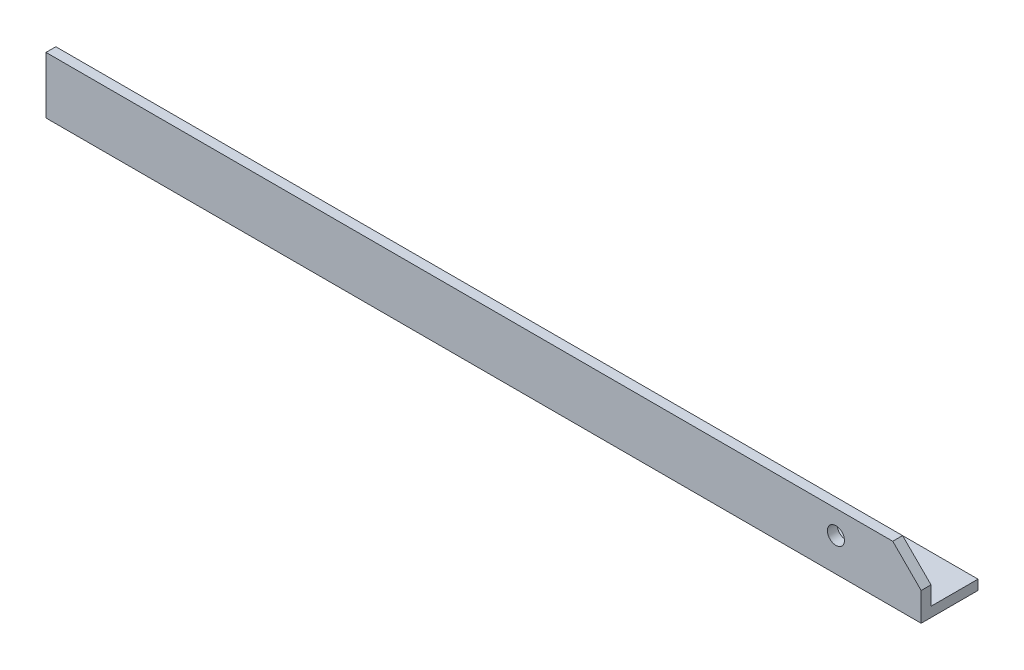
ISO-10303-21;
HEADER;
FILE_DESCRIPTION(('STEP AP214'),'2;1');
FILE_NAME('part.step','',(''),(''),'','','');
FILE_SCHEMA(('AUTOMOTIVE_DESIGN { 1 0 10303 214 1 1 1 1 }'));
ENDSEC;
DATA;
#1=APPLICATION_CONTEXT('core data for automotive mechanical design processes');
#2=APPLICATION_PROTOCOL_DEFINITION('international standard','automotive_design',2000,#1);
#3=PRODUCT_CONTEXT('',#1,'mechanical');
#4=PRODUCT('Part','Part','',(#3));
#5=PRODUCT_RELATED_PRODUCT_CATEGORY('part','',(#4));
#6=PRODUCT_DEFINITION_FORMATION('','',#4);
#7=PRODUCT_DEFINITION_CONTEXT('part definition',#1,'design');
#8=PRODUCT_DEFINITION('design','',#6,#7);
#9=PRODUCT_DEFINITION_SHAPE('','',#8);
#10=(LENGTH_UNIT() NAMED_UNIT(*) SI_UNIT(.MILLI.,.METRE.));
#11=(NAMED_UNIT(*) PLANE_ANGLE_UNIT() SI_UNIT($,.RADIAN.));
#12=(NAMED_UNIT(*) SI_UNIT($,.STERADIAN.) SOLID_ANGLE_UNIT());
#13=UNCERTAINTY_MEASURE_WITH_UNIT(LENGTH_MEASURE(1.E-05),#10,'distance_accuracy_value','');
#14=(GEOMETRIC_REPRESENTATION_CONTEXT(3) GLOBAL_UNCERTAINTY_ASSIGNED_CONTEXT((#13)) GLOBAL_UNIT_ASSIGNED_CONTEXT((#10,
#11,#12)) REPRESENTATION_CONTEXT('',''));
#15=CARTESIAN_POINT('',(0.,0.,0.));
#16=DIRECTION('',(0.,0.,1.));
#17=DIRECTION('',(1.,0.,0.));
#18=AXIS2_PLACEMENT_3D('',#15,#16,#17);
#19=CARTESIAN_POINT('',(308.,20.,0.));
#20=DIRECTION('',(0.,0.,-1.));
#21=DIRECTION('',(0.,1.,0.));
#22=AXIS2_PLACEMENT_3D('',#19,#20,#21);
#23=PLANE('',#22);
#24=CARTESIAN_POINT('',(278.,11.75,0.));
#25=DIRECTION('',(0.,0.,1.));
#26=DIRECTION('',(1.,0.,0.));
#27=AXIS2_PLACEMENT_3D('',#24,#25,#26);
#28=CIRCLE('',#27,2.99999999999999);
#29=CARTESIAN_POINT('',(281.,11.75,0.));
#30=VERTEX_POINT('',#29);
#31=EDGE_CURVE('E110',#30,#30,#28,.T.);
#32=ORIENTED_EDGE('',*,*,#31,.F.);
#33=EDGE_LOOP('',(#32));
#34=FACE_BOUND('',#33,.T.);
#35=DIRECTION('',(0.,-1.,0.));
#36=VECTOR('',#35,1.);
#37=CARTESIAN_POINT('',(308.,20.,0.));
#38=LINE('',#37,#36);
#39=CARTESIAN_POINT('',(308.,10.,0.));
#40=VERTEX_POINT('',#39);
#41=CARTESIAN_POINT('',(308.,0.,0.));
#42=VERTEX_POINT('',#41);
#43=EDGE_CURVE('E93',#40,#42,#38,.T.);
#44=ORIENTED_EDGE('',*,*,#43,.F.);
#45=DIRECTION('',(0.707106781186548,-0.707106781186547,0.));
#46=VECTOR('',#45,1.);
#47=CARTESIAN_POINT('',(308.,10.,0.));
#48=LINE('',#47,#46);
#49=CARTESIAN_POINT('',(298.,20.,0.));
#50=VERTEX_POINT('',#49);
#51=EDGE_CURVE('E51',#50,#40,#48,.T.);
#52=ORIENTED_EDGE('',*,*,#51,.F.);
#53=DIRECTION('',(-1.,0.,0.));
#54=VECTOR('',#53,1.);
#55=CARTESIAN_POINT('',(308.,20.,0.));
#56=LINE('',#55,#54);
#57=CARTESIAN_POINT('',(0.,20.,0.));
#58=VERTEX_POINT('',#57);
#59=EDGE_CURVE('E87',#50,#58,#56,.T.);
#60=ORIENTED_EDGE('',*,*,#59,.T.);
#61=DIRECTION('',(0.,-1.,0.));
#62=VECTOR('',#61,1.);
#63=CARTESIAN_POINT('',(0.,20.,0.));
#64=LINE('',#63,#62);
#65=CARTESIAN_POINT('',(0.,0.,0.));
#66=VERTEX_POINT('',#65);
#67=EDGE_CURVE('E139',#58,#66,#64,.T.);
#68=ORIENTED_EDGE('',*,*,#67,.T.);
#69=DIRECTION('',(-1.,0.,0.));
#70=VECTOR('',#69,1.);
#71=CARTESIAN_POINT('',(308.,0.,0.));
#72=LINE('',#71,#70);
#73=EDGE_CURVE('E45',#42,#66,#72,.T.);
#74=ORIENTED_EDGE('',*,*,#73,.F.);
#75=EDGE_LOOP('',(#44,#52,#60,#68,#74));
#76=FACE_BOUND('',#75,.T.);
#77=ADVANCED_FACE('F37',(#34,#76),#23,.F.);
#78=CARTESIAN_POINT('',(308.,0.,0.));
#79=DIRECTION('',(0.,1.,0.));
#80=DIRECTION('',(0.,0.,1.));
#81=AXIS2_PLACEMENT_3D('',#78,#79,#80);
#82=PLANE('',#81);
#83=DIRECTION('',(0.,0.,-1.));
#84=VECTOR('',#83,1.);
#85=CARTESIAN_POINT('',(0.,0.,0.));
#86=LINE('',#85,#84);
#87=CARTESIAN_POINT('',(0.,0.,-20.));
#88=VERTEX_POINT('',#87);
#89=EDGE_CURVE('E137',#66,#88,#86,.T.);
#90=ORIENTED_EDGE('',*,*,#89,.T.);
#91=DIRECTION('',(-1.,0.,0.));
#92=VECTOR('',#91,1.);
#93=CARTESIAN_POINT('',(308.,0.,-20.));
#94=LINE('',#93,#92);
#95=CARTESIAN_POINT('',(308.,0.,-20.));
#96=VERTEX_POINT('',#95);
#97=EDGE_CURVE('E130',#96,#88,#94,.T.);
#98=ORIENTED_EDGE('',*,*,#97,.F.);
#99=DIRECTION('',(0.,0.,-1.));
#100=VECTOR('',#99,1.);
#101=CARTESIAN_POINT('',(308.,0.,0.));
#102=LINE('',#101,#100);
#103=EDGE_CURVE('E138',#42,#96,#102,.T.);
#104=ORIENTED_EDGE('',*,*,#103,.F.);
#105=ORIENTED_EDGE('',*,*,#73,.T.);
#106=EDGE_LOOP('',(#90,#98,#104,#105));
#107=FACE_BOUND('',#106,.T.);
#108=ADVANCED_FACE('F135',(#107),#82,.F.);
#109=CARTESIAN_POINT('',(308.,0.,-20.));
#110=DIRECTION('',(0.,0.,1.));
#111=DIRECTION('',(1.,0.,0.));
#112=AXIS2_PLACEMENT_3D('',#109,#110,#111);
#113=PLANE('',#112);
#114=DIRECTION('',(0.,1.,0.));
#115=VECTOR('',#114,1.);
#116=CARTESIAN_POINT('',(0.,0.,-20.));
#117=LINE('',#116,#115);
#118=CARTESIAN_POINT('',(0.,3.46117846701572,-20.));
#119=VERTEX_POINT('',#118);
#120=EDGE_CURVE('E142',#88,#119,#117,.T.);
#121=ORIENTED_EDGE('',*,*,#120,.T.);
#122=DIRECTION('',(-1.,0.,0.));
#123=VECTOR('',#122,1.);
#124=CARTESIAN_POINT('',(308.,3.46117846701572,-20.));
#125=LINE('',#124,#123);
#126=CARTESIAN_POINT('',(308.,3.46117846701572,-20.));
#127=VERTEX_POINT('',#126);
#128=EDGE_CURVE('E127',#127,#119,#125,.T.);
#129=ORIENTED_EDGE('',*,*,#128,.F.);
#130=DIRECTION('',(0.,1.,0.));
#131=VECTOR('',#130,1.);
#132=CARTESIAN_POINT('',(308.,0.,-20.));
#133=LINE('',#132,#131);
#134=EDGE_CURVE('E154',#96,#127,#133,.T.);
#135=ORIENTED_EDGE('',*,*,#134,.F.);
#136=ORIENTED_EDGE('',*,*,#97,.T.);
#137=EDGE_LOOP('',(#121,#129,#135,#136));
#138=FACE_BOUND('',#137,.T.);
#139=ADVANCED_FACE('F162',(#138),#113,.F.);
#140=CARTESIAN_POINT('',(308.,3.46117846701572,-20.));
#141=DIRECTION('',(0.,-1.,0.));
#142=DIRECTION('',(0.,0.,-1.));
#143=AXIS2_PLACEMENT_3D('',#140,#141,#142);
#144=PLANE('',#143);
#145=DIRECTION('',(0.,0.,1.));
#146=VECTOR('',#145,1.);
#147=CARTESIAN_POINT('',(0.,3.46117846701572,-20.));
#148=LINE('',#147,#146);
#149=CARTESIAN_POINT('',(0.,3.46117846701572,-3.46117846701572));
#150=VERTEX_POINT('',#149);
#151=EDGE_CURVE('E148',#119,#150,#148,.T.);
#152=ORIENTED_EDGE('',*,*,#151,.T.);
#153=DIRECTION('',(-1.,0.,0.));
#154=VECTOR('',#153,1.);
#155=CARTESIAN_POINT('',(308.,3.46117846701572,-3.46117846701572));
#156=LINE('',#155,#154);
#157=CARTESIAN_POINT('',(308.,3.46117846701572,-3.46117846701572));
#158=VERTEX_POINT('',#157);
#159=EDGE_CURVE('E119',#158,#150,#156,.T.);
#160=ORIENTED_EDGE('',*,*,#159,.F.);
#161=DIRECTION('',(0.,0.,1.));
#162=VECTOR('',#161,1.);
#163=CARTESIAN_POINT('',(308.,3.46117846701572,-20.));
#164=LINE('',#163,#162);
#165=EDGE_CURVE('E60',#127,#158,#164,.T.);
#166=ORIENTED_EDGE('',*,*,#165,.F.);
#167=ORIENTED_EDGE('',*,*,#128,.T.);
#168=EDGE_LOOP('',(#152,#160,#166,#167));
#169=FACE_BOUND('',#168,.T.);
#170=ADVANCED_FACE('F166',(#169),#144,.F.);
#171=CARTESIAN_POINT('',(308.,3.46117846701572,-3.46117846701572));
#172=DIRECTION('',(0.,0.,1.));
#173=DIRECTION('',(1.,0.,0.));
#174=AXIS2_PLACEMENT_3D('',#171,#172,#173);
#175=PLANE('',#174);
#176=CARTESIAN_POINT('',(278.,11.75,-3.46117846701572));
#177=DIRECTION('',(0.,0.,1.));
#178=DIRECTION('',(1.,0.,0.));
#179=AXIS2_PLACEMENT_3D('',#176,#177,#178);
#180=CIRCLE('',#179,2.99999999999999);
#181=CARTESIAN_POINT('',(281.,11.75,-3.46117846701572));
#182=VERTEX_POINT('',#181);
#183=EDGE_CURVE('E40',#182,#182,#180,.T.);
#184=ORIENTED_EDGE('',*,*,#183,.T.);
#185=EDGE_LOOP('',(#184));
#186=FACE_BOUND('',#185,.T.);
#187=DIRECTION('',(-1.,0.,0.));
#188=VECTOR('',#187,1.);
#189=CARTESIAN_POINT('',(308.,20.,-3.46117846701572));
#190=LINE('',#189,#188);
#191=CARTESIAN_POINT('',(298.,20.,-3.46117846701572));
#192=VERTEX_POINT('',#191);
#193=CARTESIAN_POINT('',(0.,20.,-3.46117846701572));
#194=VERTEX_POINT('',#193);
#195=EDGE_CURVE('E116',#192,#194,#190,.T.);
#196=ORIENTED_EDGE('',*,*,#195,.F.);
#197=DIRECTION('',(0.707106781186548,-0.707106781186547,0.));
#198=VECTOR('',#197,1.);
#199=CARTESIAN_POINT('',(311.269410766492,6.73058923350786,-3.46117846701572));
#200=LINE('',#199,#198);
#201=CARTESIAN_POINT('',(308.,10.,-3.46117846701572));
#202=VERTEX_POINT('',#201);
#203=EDGE_CURVE('E105',#192,#202,#200,.T.);
#204=ORIENTED_EDGE('',*,*,#203,.T.);
#205=DIRECTION('',(0.,1.,0.));
#206=VECTOR('',#205,1.);
#207=CARTESIAN_POINT('',(308.,3.46117846701572,-3.46117846701572));
#208=LINE('',#207,#206);
#209=EDGE_CURVE('E117',#158,#202,#208,.T.);
#210=ORIENTED_EDGE('',*,*,#209,.F.);
#211=ORIENTED_EDGE('',*,*,#159,.T.);
#212=DIRECTION('',(0.,1.,0.));
#213=VECTOR('',#212,1.);
#214=CARTESIAN_POINT('',(0.,3.46117846701572,-3.46117846701572));
#215=LINE('',#214,#213);
#216=EDGE_CURVE('E149',#150,#194,#215,.T.);
#217=ORIENTED_EDGE('',*,*,#216,.T.);
#218=EDGE_LOOP('',(#196,#204,#210,#211,#217));
#219=FACE_BOUND('',#218,.T.);
#220=ADVANCED_FACE('F168',(#186,#219),#175,.F.);
#221=CARTESIAN_POINT('',(308.,20.,-3.46117846701572));
#222=DIRECTION('',(0.,-1.,0.));
#223=DIRECTION('',(0.,0.,-1.));
#224=AXIS2_PLACEMENT_3D('',#221,#222,#223);
#225=PLANE('',#224);
#226=ORIENTED_EDGE('',*,*,#59,.F.);
#227=DIRECTION('',(0.,0.,1.));
#228=VECTOR('',#227,1.);
#229=CARTESIAN_POINT('',(298.,20.,-20.));
#230=LINE('',#229,#228);
#231=EDGE_CURVE('E102',#192,#50,#230,.T.);
#232=ORIENTED_EDGE('',*,*,#231,.F.);
#233=ORIENTED_EDGE('',*,*,#195,.T.);
#234=DIRECTION('',(0.,0.,1.));
#235=VECTOR('',#234,1.);
#236=CARTESIAN_POINT('',(0.,20.,-3.46117846701572));
#237=LINE('',#236,#235);
#238=EDGE_CURVE('E114',#194,#58,#237,.T.);
#239=ORIENTED_EDGE('',*,*,#238,.T.);
#240=EDGE_LOOP('',(#226,#232,#233,#239));
#241=FACE_BOUND('',#240,.T.);
#242=ADVANCED_FACE('F112',(#241),#225,.F.);
#243=CARTESIAN_POINT('',(308.,0.,0.));
#244=DIRECTION('',(1.,0.,0.));
#245=DIRECTION('',(0.,0.,-1.));
#246=AXIS2_PLACEMENT_3D('',#243,#244,#245);
#247=PLANE('',#246);
#248=DIRECTION('',(0.,0.,-1.));
#249=VECTOR('',#248,1.);
#250=CARTESIAN_POINT('',(308.,10.,0.));
#251=LINE('',#250,#249);
#252=EDGE_CURVE('E11',#40,#202,#251,.T.);
#253=ORIENTED_EDGE('',*,*,#252,.F.);
#254=ORIENTED_EDGE('',*,*,#43,.T.);
#255=ORIENTED_EDGE('',*,*,#103,.T.);
#256=ORIENTED_EDGE('',*,*,#134,.T.);
#257=ORIENTED_EDGE('',*,*,#165,.T.);
#258=ORIENTED_EDGE('',*,*,#209,.T.);
#259=EDGE_LOOP('',(#253,#254,#255,#256,#257,#258));
#260=FACE_BOUND('',#259,.T.);
#261=ADVANCED_FACE('F160',(#260),#247,.T.);
#262=CARTESIAN_POINT('',(0.,0.,0.));
#263=DIRECTION('',(1.,0.,0.));
#264=DIRECTION('',(0.,0.,-1.));
#265=AXIS2_PLACEMENT_3D('',#262,#263,#264);
#266=PLANE('',#265);
#267=ORIENTED_EDGE('',*,*,#67,.F.);
#268=ORIENTED_EDGE('',*,*,#238,.F.);
#269=ORIENTED_EDGE('',*,*,#216,.F.);
#270=ORIENTED_EDGE('',*,*,#151,.F.);
#271=ORIENTED_EDGE('',*,*,#120,.F.);
#272=ORIENTED_EDGE('',*,*,#89,.F.);
#273=EDGE_LOOP('',(#267,#268,#269,#270,#271,#272));
#274=FACE_BOUND('',#273,.T.);
#275=ADVANCED_FACE('F192',(#274),#266,.F.);
#276=CARTESIAN_POINT('',(308.,10.,-20.));
#277=DIRECTION('',(-0.707106781186547,-0.707106781186548,0.));
#278=DIRECTION('',(0.707106781186548,-0.707106781186547,0.));
#279=AXIS2_PLACEMENT_3D('',#276,#277,#278);
#280=PLANE('',#279);
#281=ORIENTED_EDGE('',*,*,#231,.T.);
#282=ORIENTED_EDGE('',*,*,#51,.T.);
#283=ORIENTED_EDGE('',*,*,#252,.T.);
#284=ORIENTED_EDGE('',*,*,#203,.F.);
#285=EDGE_LOOP('',(#281,#282,#283,#284));
#286=FACE_BOUND('',#285,.T.);
#287=ADVANCED_FACE('F103',(#286),#280,.F.);
#288=CARTESIAN_POINT('',(278.,11.75,-20.));
#289=DIRECTION('',(0.,0.,1.));
#290=DIRECTION('',(1.,0.,0.));
#291=AXIS2_PLACEMENT_3D('',#288,#289,#290);
#292=CYLINDRICAL_SURFACE('',#291,2.99999999999999);
#293=ORIENTED_EDGE('',*,*,#31,.T.);
#294=EDGE_LOOP('',(#293));
#295=FACE_BOUND('',#294,.T.);
#296=ORIENTED_EDGE('',*,*,#183,.F.);
#297=EDGE_LOOP('',(#296));
#298=FACE_BOUND('',#297,.T.);
#299=ADVANCED_FACE('F173',(#295,#298),#292,.F.);
#300=CLOSED_SHELL('',(#77,#108,#139,#170,#220,#242,#261,#275,#287,#299));
#301=MANIFOLD_SOLID_BREP('B2',#300);
#302=ADVANCED_BREP_SHAPE_REPRESENTATION('',(#18,#301),#14);
#303=SHAPE_DEFINITION_REPRESENTATION(#9,#302);
ENDSEC;
END-ISO-10303-21;
